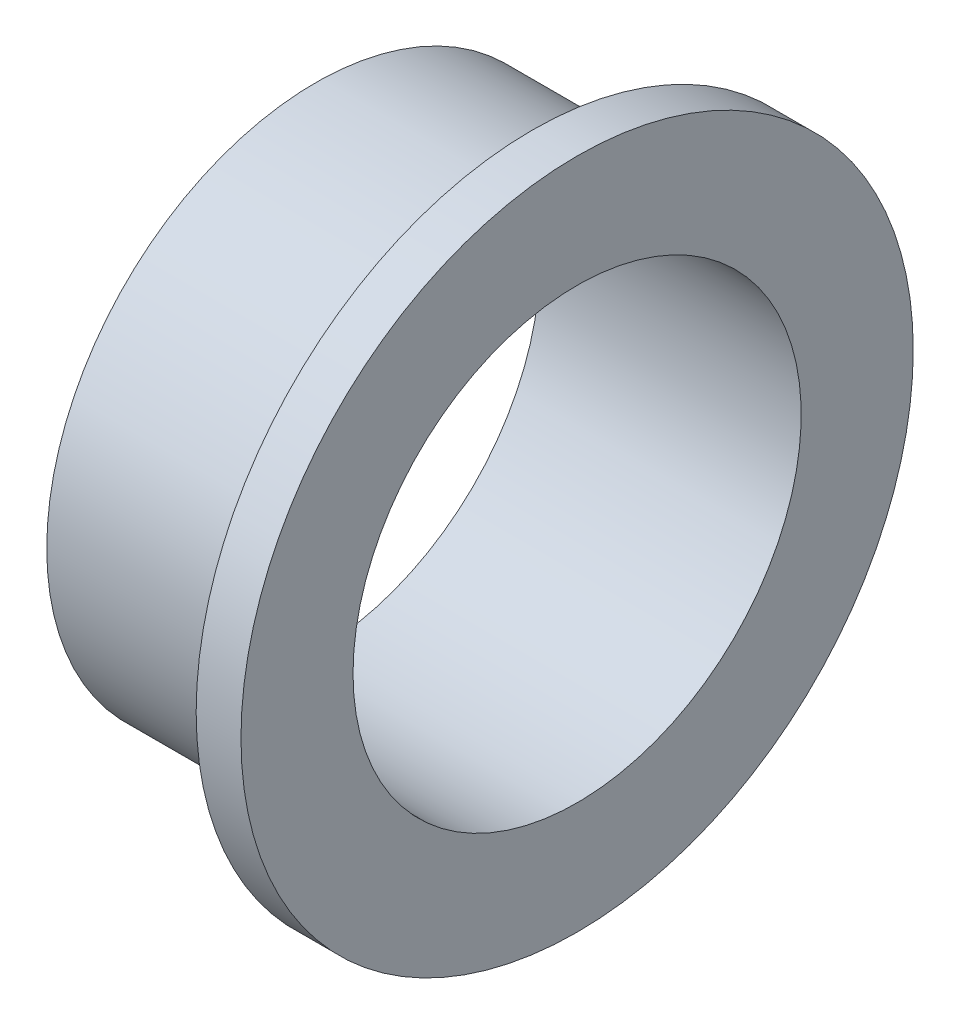
ISO-10303-21;
HEADER;
FILE_DESCRIPTION(('STEP AP214'),'2;1');
FILE_NAME('part.step','',(''),(''),'','','');
FILE_SCHEMA(('AUTOMOTIVE_DESIGN { 1 0 10303 214 1 1 1 1 }'));
ENDSEC;
DATA;
#1=APPLICATION_CONTEXT('core data for automotive mechanical design processes');
#2=APPLICATION_PROTOCOL_DEFINITION('international standard','automotive_design',2000,#1);
#3=PRODUCT_CONTEXT('',#1,'mechanical');
#4=PRODUCT('Part','Part','',(#3));
#5=PRODUCT_RELATED_PRODUCT_CATEGORY('part','',(#4));
#6=PRODUCT_DEFINITION_FORMATION('','',#4);
#7=PRODUCT_DEFINITION_CONTEXT('part definition',#1,'design');
#8=PRODUCT_DEFINITION('design','',#6,#7);
#9=PRODUCT_DEFINITION_SHAPE('','',#8);
#10=(LENGTH_UNIT() NAMED_UNIT(*) SI_UNIT(.MILLI.,.METRE.));
#11=(NAMED_UNIT(*) PLANE_ANGLE_UNIT() SI_UNIT($,.RADIAN.));
#12=(NAMED_UNIT(*) SI_UNIT($,.STERADIAN.) SOLID_ANGLE_UNIT());
#13=UNCERTAINTY_MEASURE_WITH_UNIT(LENGTH_MEASURE(1.E-05),#10,'distance_accuracy_value','');
#14=(GEOMETRIC_REPRESENTATION_CONTEXT(3) GLOBAL_UNCERTAINTY_ASSIGNED_CONTEXT((#13)) GLOBAL_UNIT_ASSIGNED_CONTEXT((#10,
#11,#12)) REPRESENTATION_CONTEXT('',''));
#15=CARTESIAN_POINT('',(0.,0.,0.));
#16=DIRECTION('',(0.,0.,1.));
#17=DIRECTION('',(1.,0.,0.));
#18=AXIS2_PLACEMENT_3D('',#15,#16,#17);
#19=CARTESIAN_POINT('',(-35.,36.,0.));
#20=DIRECTION('',(1.,0.,0.));
#21=DIRECTION('',(0.,0.,-1.));
#22=AXIS2_PLACEMENT_3D('',#19,#20,#21);
#23=PLANE('',#22);
#24=CARTESIAN_POINT('',(-35.,0.,0.));
#25=DIRECTION('',(-1.,0.,0.));
#26=DIRECTION('',(0.,0.,1.));
#27=AXIS2_PLACEMENT_3D('',#24,#25,#26);
#28=CIRCLE('',#27,30.);
#29=CARTESIAN_POINT('',(-35.,0.,30.));
#30=VERTEX_POINT('',#29);
#31=EDGE_CURVE('E10',#30,#30,#28,.T.);
#32=ORIENTED_EDGE('',*,*,#31,.F.);
#33=EDGE_LOOP('',(#32));
#34=FACE_BOUND('',#33,.T.);
#35=CARTESIAN_POINT('',(-35.,0.,0.));
#36=DIRECTION('',(-1.,0.,0.));
#37=DIRECTION('',(0.,0.,1.));
#38=AXIS2_PLACEMENT_3D('',#35,#36,#37);
#39=CIRCLE('',#38,36.);
#40=CARTESIAN_POINT('',(-35.,0.,36.));
#41=VERTEX_POINT('',#40);
#42=EDGE_CURVE('E60',#41,#41,#39,.T.);
#43=ORIENTED_EDGE('',*,*,#42,.T.);
#44=EDGE_LOOP('',(#43));
#45=FACE_BOUND('',#44,.T.);
#46=ADVANCED_FACE('F34',(#34,#45),#23,.F.);
#47=CARTESIAN_POINT('',(-57.1232876712329,0.,0.));
#48=DIRECTION('',(-1.,0.,0.));
#49=DIRECTION('',(0.,0.,1.));
#50=AXIS2_PLACEMENT_3D('',#47,#48,#49);
#51=CYLINDRICAL_SURFACE('',#50,30.);
#52=CARTESIAN_POINT('',(0.,0.,0.));
#53=DIRECTION('',(-1.,0.,0.));
#54=DIRECTION('',(0.,0.,1.));
#55=AXIS2_PLACEMENT_3D('',#52,#53,#54);
#56=CIRCLE('',#55,30.);
#57=CARTESIAN_POINT('',(0.,0.,30.));
#58=VERTEX_POINT('',#57);
#59=EDGE_CURVE('E41',#58,#58,#56,.T.);
#60=ORIENTED_EDGE('',*,*,#59,.F.);
#61=EDGE_LOOP('',(#60));
#62=FACE_BOUND('',#61,.T.);
#63=ORIENTED_EDGE('',*,*,#31,.T.);
#64=EDGE_LOOP('',(#63));
#65=FACE_BOUND('',#64,.T.);
#66=ADVANCED_FACE('F85',(#62,#65),#51,.F.);
#67=CARTESIAN_POINT('',(0.,30.,0.));
#68=DIRECTION('',(-1.,0.,0.));
#69=DIRECTION('',(0.,0.,1.));
#70=AXIS2_PLACEMENT_3D('',#67,#68,#69);
#71=PLANE('',#70);
#72=CARTESIAN_POINT('',(0.,0.,0.));
#73=DIRECTION('',(-1.,0.,0.));
#74=DIRECTION('',(0.,0.,1.));
#75=AXIS2_PLACEMENT_3D('',#72,#73,#74);
#76=CIRCLE('',#75,45.);
#77=CARTESIAN_POINT('',(0.,0.,45.));
#78=VERTEX_POINT('',#77);
#79=EDGE_CURVE('E44',#78,#78,#76,.T.);
#80=ORIENTED_EDGE('',*,*,#79,.F.);
#81=EDGE_LOOP('',(#80));
#82=FACE_BOUND('',#81,.T.);
#83=ORIENTED_EDGE('',*,*,#59,.T.);
#84=EDGE_LOOP('',(#83));
#85=FACE_BOUND('',#84,.T.);
#86=ADVANCED_FACE('F77',(#82,#85),#71,.F.);
#87=CARTESIAN_POINT('',(-57.1232876712329,0.,0.));
#88=DIRECTION('',(-1.,0.,0.));
#89=DIRECTION('',(0.,0.,1.));
#90=AXIS2_PLACEMENT_3D('',#87,#88,#89);
#91=CYLINDRICAL_SURFACE('',#90,45.);
#92=CARTESIAN_POINT('',(-6.,0.,0.));
#93=DIRECTION('',(-1.,0.,0.));
#94=DIRECTION('',(0.,0.,1.));
#95=AXIS2_PLACEMENT_3D('',#92,#93,#94);
#96=CIRCLE('',#95,45.);
#97=CARTESIAN_POINT('',(-6.,0.,45.));
#98=VERTEX_POINT('',#97);
#99=EDGE_CURVE('E47',#98,#98,#96,.T.);
#100=ORIENTED_EDGE('',*,*,#99,.F.);
#101=EDGE_LOOP('',(#100));
#102=FACE_BOUND('',#101,.T.);
#103=ORIENTED_EDGE('',*,*,#79,.T.);
#104=EDGE_LOOP('',(#103));
#105=FACE_BOUND('',#104,.T.);
#106=ADVANCED_FACE('F71',(#102,#105),#91,.T.);
#107=CARTESIAN_POINT('',(-6.,36.,0.));
#108=DIRECTION('',(1.,0.,0.));
#109=DIRECTION('',(0.,0.,-1.));
#110=AXIS2_PLACEMENT_3D('',#107,#108,#109);
#111=PLANE('',#110);
#112=CARTESIAN_POINT('',(-6.,0.,0.));
#113=DIRECTION('',(-1.,0.,0.));
#114=DIRECTION('',(0.,0.,1.));
#115=AXIS2_PLACEMENT_3D('',#112,#113,#114);
#116=CIRCLE('',#115,36.);
#117=CARTESIAN_POINT('',(-6.,0.,36.));
#118=VERTEX_POINT('',#117);
#119=EDGE_CURVE('E53',#118,#118,#116,.T.);
#120=ORIENTED_EDGE('',*,*,#119,.F.);
#121=EDGE_LOOP('',(#120));
#122=FACE_BOUND('',#121,.T.);
#123=ORIENTED_EDGE('',*,*,#99,.T.);
#124=EDGE_LOOP('',(#123));
#125=FACE_BOUND('',#124,.T.);
#126=ADVANCED_FACE('F65',(#122,#125),#111,.F.);
#127=CARTESIAN_POINT('',(-57.1232876712329,0.,0.));
#128=DIRECTION('',(-1.,0.,0.));
#129=DIRECTION('',(0.,0.,1.));
#130=AXIS2_PLACEMENT_3D('',#127,#128,#129);
#131=CYLINDRICAL_SURFACE('',#130,36.);
#132=ORIENTED_EDGE('',*,*,#42,.F.);
#133=EDGE_LOOP('',(#132));
#134=FACE_BOUND('',#133,.T.);
#135=ORIENTED_EDGE('',*,*,#119,.T.);
#136=EDGE_LOOP('',(#135));
#137=FACE_BOUND('',#136,.T.);
#138=ADVANCED_FACE('F62',(#134,#137),#131,.T.);
#139=CLOSED_SHELL('',(#46,#66,#86,#106,#126,#138));
#140=MANIFOLD_SOLID_BREP('B2',#139);
#141=ADVANCED_BREP_SHAPE_REPRESENTATION('',(#18,#140),#14);
#142=SHAPE_DEFINITION_REPRESENTATION(#9,#141);
ENDSEC;
END-ISO-10303-21;
